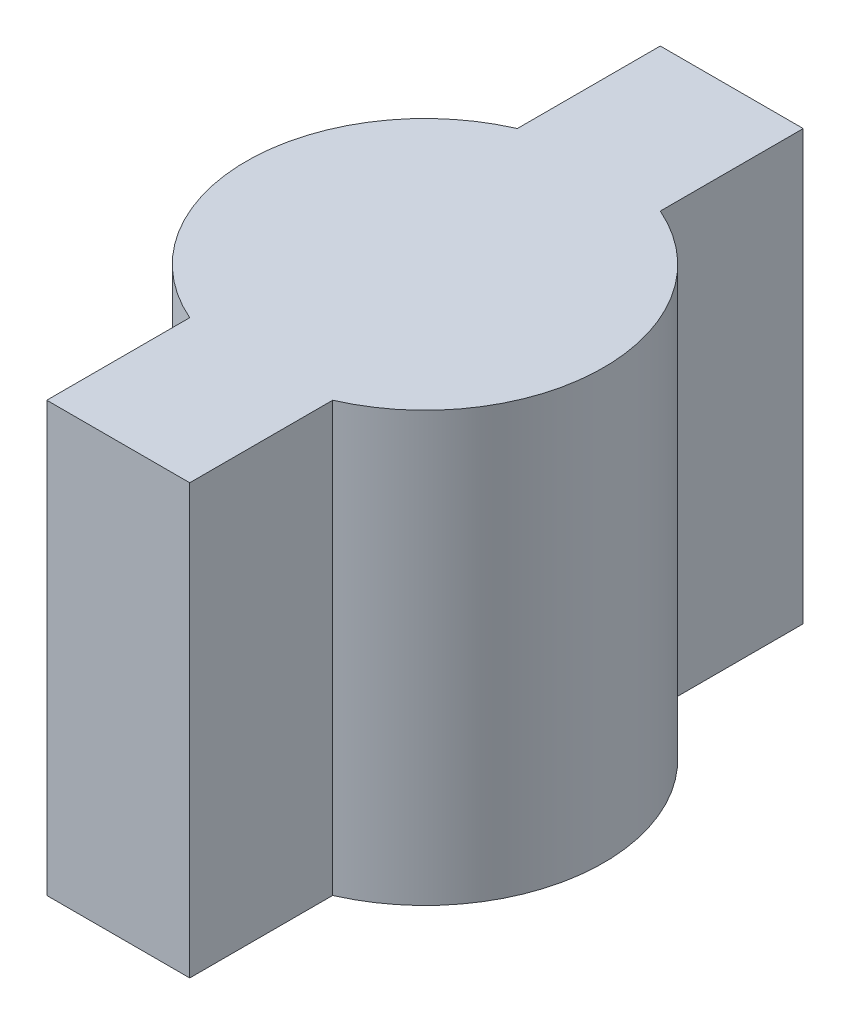
ISO-10303-21;
HEADER;
FILE_DESCRIPTION(('STEP AP214'),'2;1');
FILE_NAME('part.step','',(''),(''),'','','');
FILE_SCHEMA(('AUTOMOTIVE_DESIGN { 1 0 10303 214 1 1 1 1 }'));
ENDSEC;
DATA;
#1=APPLICATION_CONTEXT('core data for automotive mechanical design processes');
#2=APPLICATION_PROTOCOL_DEFINITION('international standard','automotive_design',2000,#1);
#3=PRODUCT_CONTEXT('',#1,'mechanical');
#4=PRODUCT('Part','Part','',(#3));
#5=PRODUCT_RELATED_PRODUCT_CATEGORY('part','',(#4));
#6=PRODUCT_DEFINITION_FORMATION('','',#4);
#7=PRODUCT_DEFINITION_CONTEXT('part definition',#1,'design');
#8=PRODUCT_DEFINITION('design','',#6,#7);
#9=PRODUCT_DEFINITION_SHAPE('','',#8);
#10=(LENGTH_UNIT() NAMED_UNIT(*) SI_UNIT(.MILLI.,.METRE.));
#11=(NAMED_UNIT(*) PLANE_ANGLE_UNIT() SI_UNIT($,.RADIAN.));
#12=(NAMED_UNIT(*) SI_UNIT($,.STERADIAN.) SOLID_ANGLE_UNIT());
#13=UNCERTAINTY_MEASURE_WITH_UNIT(LENGTH_MEASURE(1.E-05),#10,'distance_accuracy_value','');
#14=(GEOMETRIC_REPRESENTATION_CONTEXT(3) GLOBAL_UNCERTAINTY_ASSIGNED_CONTEXT((#13)) GLOBAL_UNIT_ASSIGNED_CONTEXT((#10,
#11,#12)) REPRESENTATION_CONTEXT('',''));
#15=CARTESIAN_POINT('',(0.,0.,0.));
#16=DIRECTION('',(0.,0.,1.));
#17=DIRECTION('',(1.,0.,0.));
#18=AXIS2_PLACEMENT_3D('',#15,#16,#17);
#19=CARTESIAN_POINT('',(0.,6.,0.));
#20=DIRECTION('',(0.,-1.,0.));
#21=DIRECTION('',(0.,0.,-1.));
#22=AXIS2_PLACEMENT_3D('',#19,#20,#21);
#23=CYLINDRICAL_SURFACE('',#22,2.5);
#24=CARTESIAN_POINT('',(0.,0.,0.));
#25=DIRECTION('',(0.,1.,0.));
#26=DIRECTION('',(0.,0.,1.));
#27=AXIS2_PLACEMENT_3D('',#24,#25,#26);
#28=CIRCLE('',#27,2.5);
#29=CARTESIAN_POINT('',(-1.,0.,-2.29128784747792));
#30=VERTEX_POINT('',#29);
#31=CARTESIAN_POINT('',(-1.,0.,2.29128784747792));
#32=VERTEX_POINT('',#31);
#33=EDGE_CURVE('E132',#30,#32,#28,.T.);
#34=ORIENTED_EDGE('',*,*,#33,.T.);
#35=DIRECTION('',(0.,-1.,0.));
#36=VECTOR('',#35,1.);
#37=CARTESIAN_POINT('',(-1.,6.,2.29128784747792));
#38=LINE('',#37,#36);
#39=CARTESIAN_POINT('',(-1.,6.,2.29128784747792));
#40=VERTEX_POINT('',#39);
#41=EDGE_CURVE('E11',#40,#32,#38,.T.);
#42=ORIENTED_EDGE('',*,*,#41,.F.);
#43=CARTESIAN_POINT('',(0.,6.,0.));
#44=DIRECTION('',(0.,1.,0.));
#45=DIRECTION('',(0.,0.,1.));
#46=AXIS2_PLACEMENT_3D('',#43,#44,#45);
#47=CIRCLE('',#46,2.5);
#48=CARTESIAN_POINT('',(-1.,6.,-2.29128784747792));
#49=VERTEX_POINT('',#48);
#50=EDGE_CURVE('E147',#49,#40,#47,.T.);
#51=ORIENTED_EDGE('',*,*,#50,.F.);
#52=DIRECTION('',(0.,-1.,0.));
#53=VECTOR('',#52,1.);
#54=CARTESIAN_POINT('',(-1.,6.,-2.29128784747792));
#55=LINE('',#54,#53);
#56=EDGE_CURVE('E128',#49,#30,#55,.T.);
#57=ORIENTED_EDGE('',*,*,#56,.T.);
#58=EDGE_LOOP('',(#34,#42,#51,#57));
#59=FACE_BOUND('',#58,.T.);
#60=ADVANCED_FACE('F36',(#59),#23,.T.);
#61=CARTESIAN_POINT('',(-1.,6.,4.29128784747792));
#62=DIRECTION('',(1.,0.,0.));
#63=DIRECTION('',(0.,0.,-1.));
#64=AXIS2_PLACEMENT_3D('',#61,#62,#63);
#65=PLANE('',#64);
#66=DIRECTION('',(0.,0.,1.));
#67=VECTOR('',#66,1.);
#68=CARTESIAN_POINT('',(-1.,0.,4.29128784747792));
#69=LINE('',#68,#67);
#70=CARTESIAN_POINT('',(-1.,0.,4.29128784747792));
#71=VERTEX_POINT('',#70);
#72=EDGE_CURVE('E135',#32,#71,#69,.T.);
#73=ORIENTED_EDGE('',*,*,#72,.T.);
#74=DIRECTION('',(0.,-1.,0.));
#75=VECTOR('',#74,1.);
#76=CARTESIAN_POINT('',(-1.,6.,4.29128784747792));
#77=LINE('',#76,#75);
#78=CARTESIAN_POINT('',(-1.,6.,4.29128784747792));
#79=VERTEX_POINT('',#78);
#80=EDGE_CURVE('E44',#79,#71,#77,.T.);
#81=ORIENTED_EDGE('',*,*,#80,.F.);
#82=DIRECTION('',(0.,0.,1.));
#83=VECTOR('',#82,1.);
#84=CARTESIAN_POINT('',(-1.,6.,4.29128784747792));
#85=LINE('',#84,#83);
#86=EDGE_CURVE('E95',#40,#79,#85,.T.);
#87=ORIENTED_EDGE('',*,*,#86,.F.);
#88=ORIENTED_EDGE('',*,*,#41,.T.);
#89=EDGE_LOOP('',(#73,#81,#87,#88));
#90=FACE_BOUND('',#89,.T.);
#91=ADVANCED_FACE('F203',(#90),#65,.F.);
#92=CARTESIAN_POINT('',(1.,6.,4.29128784747792));
#93=DIRECTION('',(0.,0.,-1.));
#94=DIRECTION('',(-1.,0.,0.));
#95=AXIS2_PLACEMENT_3D('',#92,#93,#94);
#96=PLANE('',#95);
#97=DIRECTION('',(1.,0.,0.));
#98=VECTOR('',#97,1.);
#99=CARTESIAN_POINT('',(1.,0.,4.29128784747792));
#100=LINE('',#99,#98);
#101=CARTESIAN_POINT('',(1.,0.,4.29128784747792));
#102=VERTEX_POINT('',#101);
#103=EDGE_CURVE('E138',#71,#102,#100,.T.);
#104=ORIENTED_EDGE('',*,*,#103,.T.);
#105=DIRECTION('',(0.,-1.,0.));
#106=VECTOR('',#105,1.);
#107=CARTESIAN_POINT('',(1.,6.,4.29128784747792));
#108=LINE('',#107,#106);
#109=CARTESIAN_POINT('',(1.,6.,4.29128784747792));
#110=VERTEX_POINT('',#109);
#111=EDGE_CURVE('E154',#110,#102,#108,.T.);
#112=ORIENTED_EDGE('',*,*,#111,.F.);
#113=DIRECTION('',(1.,0.,0.));
#114=VECTOR('',#113,1.);
#115=CARTESIAN_POINT('',(1.,6.,4.29128784747792));
#116=LINE('',#115,#114);
#117=EDGE_CURVE('E162',#79,#110,#116,.T.);
#118=ORIENTED_EDGE('',*,*,#117,.F.);
#119=ORIENTED_EDGE('',*,*,#80,.T.);
#120=EDGE_LOOP('',(#104,#112,#118,#119));
#121=FACE_BOUND('',#120,.T.);
#122=ADVANCED_FACE('F160',(#121),#96,.F.);
#123=CARTESIAN_POINT('',(1.,6.,2.29128784747792));
#124=DIRECTION('',(-1.,0.,0.));
#125=DIRECTION('',(0.,0.,1.));
#126=AXIS2_PLACEMENT_3D('',#123,#124,#125);
#127=PLANE('',#126);
#128=DIRECTION('',(0.,0.,-1.));
#129=VECTOR('',#128,1.);
#130=CARTESIAN_POINT('',(1.,0.,2.29128784747792));
#131=LINE('',#130,#129);
#132=CARTESIAN_POINT('',(1.,0.,2.29128784747792));
#133=VERTEX_POINT('',#132);
#134=EDGE_CURVE('E140',#102,#133,#131,.T.);
#135=ORIENTED_EDGE('',*,*,#134,.T.);
#136=DIRECTION('',(0.,-1.,0.));
#137=VECTOR('',#136,1.);
#138=CARTESIAN_POINT('',(1.,6.,2.29128784747792));
#139=LINE('',#138,#137);
#140=CARTESIAN_POINT('',(1.,6.,2.29128784747792));
#141=VERTEX_POINT('',#140);
#142=EDGE_CURVE('E151',#141,#133,#139,.T.);
#143=ORIENTED_EDGE('',*,*,#142,.F.);
#144=DIRECTION('',(0.,0.,-1.));
#145=VECTOR('',#144,1.);
#146=CARTESIAN_POINT('',(1.,6.,2.29128784747792));
#147=LINE('',#146,#145);
#148=EDGE_CURVE('E174',#110,#141,#147,.T.);
#149=ORIENTED_EDGE('',*,*,#148,.F.);
#150=ORIENTED_EDGE('',*,*,#111,.T.);
#151=EDGE_LOOP('',(#135,#143,#149,#150));
#152=FACE_BOUND('',#151,.T.);
#153=ADVANCED_FACE('F170',(#152),#127,.F.);
#154=CARTESIAN_POINT('',(0.,6.,0.));
#155=DIRECTION('',(0.,-1.,0.));
#156=DIRECTION('',(0.,0.,-1.));
#157=AXIS2_PLACEMENT_3D('',#154,#155,#156);
#158=CYLINDRICAL_SURFACE('',#157,2.5);
#159=CARTESIAN_POINT('',(0.,0.,0.));
#160=DIRECTION('',(0.,1.,0.));
#161=DIRECTION('',(0.,0.,1.));
#162=AXIS2_PLACEMENT_3D('',#159,#160,#161);
#163=CIRCLE('',#162,2.5);
#164=CARTESIAN_POINT('',(1.,0.,-2.29128784747792));
#165=VERTEX_POINT('',#164);
#166=EDGE_CURVE('E142',#133,#165,#163,.T.);
#167=ORIENTED_EDGE('',*,*,#166,.T.);
#168=DIRECTION('',(0.,-1.,0.));
#169=VECTOR('',#168,1.);
#170=CARTESIAN_POINT('',(1.,6.,-2.29128784747792));
#171=LINE('',#170,#169);
#172=CARTESIAN_POINT('',(1.,6.,-2.29128784747792));
#173=VERTEX_POINT('',#172);
#174=EDGE_CURVE('E123',#173,#165,#171,.T.);
#175=ORIENTED_EDGE('',*,*,#174,.F.);
#176=CARTESIAN_POINT('',(0.,6.,0.));
#177=DIRECTION('',(0.,1.,0.));
#178=DIRECTION('',(0.,0.,1.));
#179=AXIS2_PLACEMENT_3D('',#176,#177,#178);
#180=CIRCLE('',#179,2.5);
#181=EDGE_CURVE('E114',#141,#173,#180,.T.);
#182=ORIENTED_EDGE('',*,*,#181,.F.);
#183=ORIENTED_EDGE('',*,*,#142,.T.);
#184=EDGE_LOOP('',(#167,#175,#182,#183));
#185=FACE_BOUND('',#184,.T.);
#186=ADVANCED_FACE('F173',(#185),#158,.T.);
#187=CARTESIAN_POINT('',(1.,6.,-4.29128784747792));
#188=DIRECTION('',(-1.,0.,0.));
#189=DIRECTION('',(0.,0.,1.));
#190=AXIS2_PLACEMENT_3D('',#187,#188,#189);
#191=PLANE('',#190);
#192=DIRECTION('',(0.,0.,-1.));
#193=VECTOR('',#192,1.);
#194=CARTESIAN_POINT('',(1.,0.,-4.29128784747792));
#195=LINE('',#194,#193);
#196=CARTESIAN_POINT('',(1.,0.,-4.29128784747792));
#197=VERTEX_POINT('',#196);
#198=EDGE_CURVE('E122',#165,#197,#195,.T.);
#199=ORIENTED_EDGE('',*,*,#198,.T.);
#200=DIRECTION('',(0.,-1.,0.));
#201=VECTOR('',#200,1.);
#202=CARTESIAN_POINT('',(1.,6.,-4.29128784747792));
#203=LINE('',#202,#201);
#204=CARTESIAN_POINT('',(1.,6.,-4.29128784747792));
#205=VERTEX_POINT('',#204);
#206=EDGE_CURVE('E119',#205,#197,#203,.T.);
#207=ORIENTED_EDGE('',*,*,#206,.F.);
#208=DIRECTION('',(0.,0.,-1.));
#209=VECTOR('',#208,1.);
#210=CARTESIAN_POINT('',(1.,6.,-4.29128784747792));
#211=LINE('',#210,#209);
#212=EDGE_CURVE('E108',#173,#205,#211,.T.);
#213=ORIENTED_EDGE('',*,*,#212,.F.);
#214=ORIENTED_EDGE('',*,*,#174,.T.);
#215=EDGE_LOOP('',(#199,#207,#213,#214));
#216=FACE_BOUND('',#215,.T.);
#217=ADVANCED_FACE('F120',(#216),#191,.F.);
#218=CARTESIAN_POINT('',(-1.,6.,-4.29128784747792));
#219=DIRECTION('',(0.,0.,1.));
#220=DIRECTION('',(1.,0.,0.));
#221=AXIS2_PLACEMENT_3D('',#218,#219,#220);
#222=PLANE('',#221);
#223=DIRECTION('',(-1.,0.,0.));
#224=VECTOR('',#223,1.);
#225=CARTESIAN_POINT('',(-1.,0.,-4.29128784747792));
#226=LINE('',#225,#224);
#227=CARTESIAN_POINT('',(-1.,0.,-4.29128784747792));
#228=VERTEX_POINT('',#227);
#229=EDGE_CURVE('E81',#197,#228,#226,.T.);
#230=ORIENTED_EDGE('',*,*,#229,.T.);
#231=DIRECTION('',(0.,-1.,0.));
#232=VECTOR('',#231,1.);
#233=CARTESIAN_POINT('',(-1.,6.,-4.29128784747792));
#234=LINE('',#233,#232);
#235=CARTESIAN_POINT('',(-1.,6.,-4.29128784747792));
#236=VERTEX_POINT('',#235);
#237=EDGE_CURVE('E124',#236,#228,#234,.T.);
#238=ORIENTED_EDGE('',*,*,#237,.F.);
#239=DIRECTION('',(-1.,0.,0.));
#240=VECTOR('',#239,1.);
#241=CARTESIAN_POINT('',(-1.,6.,-4.29128784747792));
#242=LINE('',#241,#240);
#243=EDGE_CURVE('E112',#205,#236,#242,.T.);
#244=ORIENTED_EDGE('',*,*,#243,.F.);
#245=ORIENTED_EDGE('',*,*,#206,.T.);
#246=EDGE_LOOP('',(#230,#238,#244,#245));
#247=FACE_BOUND('',#246,.T.);
#248=ADVANCED_FACE('F126',(#247),#222,.F.);
#249=CARTESIAN_POINT('',(-1.,6.,-2.29128784747792));
#250=DIRECTION('',(1.,0.,0.));
#251=DIRECTION('',(0.,0.,-1.));
#252=AXIS2_PLACEMENT_3D('',#249,#250,#251);
#253=PLANE('',#252);
#254=DIRECTION('',(0.,0.,1.));
#255=VECTOR('',#254,1.);
#256=CARTESIAN_POINT('',(-1.,0.,-2.29128784747792));
#257=LINE('',#256,#255);
#258=EDGE_CURVE('E87',#228,#30,#257,.T.);
#259=ORIENTED_EDGE('',*,*,#258,.T.);
#260=ORIENTED_EDGE('',*,*,#56,.F.);
#261=DIRECTION('',(0.,0.,1.));
#262=VECTOR('',#261,1.);
#263=CARTESIAN_POINT('',(-1.,6.,-2.29128784747792));
#264=LINE('',#263,#262);
#265=EDGE_CURVE('E52',#236,#49,#264,.T.);
#266=ORIENTED_EDGE('',*,*,#265,.F.);
#267=ORIENTED_EDGE('',*,*,#237,.T.);
#268=EDGE_LOOP('',(#259,#260,#266,#267));
#269=FACE_BOUND('',#268,.T.);
#270=ADVANCED_FACE('F199',(#269),#253,.F.);
#271=CARTESIAN_POINT('',(0.,6.,0.));
#272=DIRECTION('',(0.,1.,0.));
#273=DIRECTION('',(0.,0.,1.));
#274=AXIS2_PLACEMENT_3D('',#271,#272,#273);
#275=PLANE('',#274);
#276=ORIENTED_EDGE('',*,*,#50,.T.);
#277=ORIENTED_EDGE('',*,*,#86,.T.);
#278=ORIENTED_EDGE('',*,*,#117,.T.);
#279=ORIENTED_EDGE('',*,*,#148,.T.);
#280=ORIENTED_EDGE('',*,*,#181,.T.);
#281=ORIENTED_EDGE('',*,*,#212,.T.);
#282=ORIENTED_EDGE('',*,*,#243,.T.);
#283=ORIENTED_EDGE('',*,*,#265,.T.);
#284=EDGE_LOOP('',(#276,#277,#278,#279,#280,#281,#282,#283));
#285=FACE_BOUND('',#284,.T.);
#286=ADVANCED_FACE('F110',(#285),#275,.T.);
#287=CARTESIAN_POINT('',(0.,0.,0.));
#288=DIRECTION('',(0.,1.,0.));
#289=DIRECTION('',(0.,0.,1.));
#290=AXIS2_PLACEMENT_3D('',#287,#288,#289);
#291=PLANE('',#290);
#292=CARTESIAN_POINT('',(0.,0.,0.));
#293=DIRECTION('',(0.,-1.,0.));
#294=DIRECTION('',(0.,0.,-1.));
#295=AXIS2_PLACEMENT_3D('',#292,#293,#294);
#296=CIRCLE('',#295,2.);
#297=CARTESIAN_POINT('',(0.,0.,-2.));
#298=VERTEX_POINT('',#297);
#299=EDGE_CURVE('E180',#298,#298,#296,.T.);
#300=ORIENTED_EDGE('',*,*,#299,.F.);
#301=EDGE_LOOP('',(#300));
#302=FACE_BOUND('',#301,.T.);
#303=ORIENTED_EDGE('',*,*,#33,.F.);
#304=ORIENTED_EDGE('',*,*,#258,.F.);
#305=ORIENTED_EDGE('',*,*,#229,.F.);
#306=ORIENTED_EDGE('',*,*,#198,.F.);
#307=ORIENTED_EDGE('',*,*,#166,.F.);
#308=ORIENTED_EDGE('',*,*,#134,.F.);
#309=ORIENTED_EDGE('',*,*,#103,.F.);
#310=ORIENTED_EDGE('',*,*,#72,.F.);
#311=EDGE_LOOP('',(#303,#304,#305,#306,#307,#308,#309,#310));
#312=FACE_BOUND('',#311,.T.);
#313=ADVANCED_FACE('F166',(#302,#312),#291,.F.);
#314=CARTESIAN_POINT('',(0.,5.,0.));
#315=DIRECTION('',(0.,-1.,0.));
#316=DIRECTION('',(0.,0.,-1.));
#317=AXIS2_PLACEMENT_3D('',#314,#315,#316);
#318=CYLINDRICAL_SURFACE('',#317,2.);
#319=CARTESIAN_POINT('',(0.,5.,0.));
#320=DIRECTION('',(0.,-1.,0.));
#321=DIRECTION('',(0.,0.,-1.));
#322=AXIS2_PLACEMENT_3D('',#319,#320,#321);
#323=CIRCLE('',#322,2.);
#324=CARTESIAN_POINT('',(0.,5.,-2.));
#325=VERTEX_POINT('',#324);
#326=EDGE_CURVE('E136',#325,#325,#323,.T.);
#327=ORIENTED_EDGE('',*,*,#326,.F.);
#328=EDGE_LOOP('',(#327));
#329=FACE_BOUND('',#328,.T.);
#330=ORIENTED_EDGE('',*,*,#299,.T.);
#331=EDGE_LOOP('',(#330));
#332=FACE_BOUND('',#331,.T.);
#333=ADVANCED_FACE('F188',(#329,#332),#318,.F.);
#334=CARTESIAN_POINT('',(0.,5.,0.));
#335=DIRECTION('',(0.,-1.,0.));
#336=DIRECTION('',(0.,0.,-1.));
#337=AXIS2_PLACEMENT_3D('',#334,#335,#336);
#338=PLANE('',#337);
#339=ORIENTED_EDGE('',*,*,#326,.T.);
#340=EDGE_LOOP('',(#339));
#341=FACE_BOUND('',#340,.T.);
#342=ADVANCED_FACE('F186',(#341),#338,.T.);
#343=CLOSED_SHELL('',(#60,#91,#122,#153,#186,#217,#248,#270,#286,#313,#333,#342));
#344=MANIFOLD_SOLID_BREP('B2',#343);
#345=ADVANCED_BREP_SHAPE_REPRESENTATION('',(#18,#344),#14);
#346=SHAPE_DEFINITION_REPRESENTATION(#9,#345);
ENDSEC;
END-ISO-10303-21;
